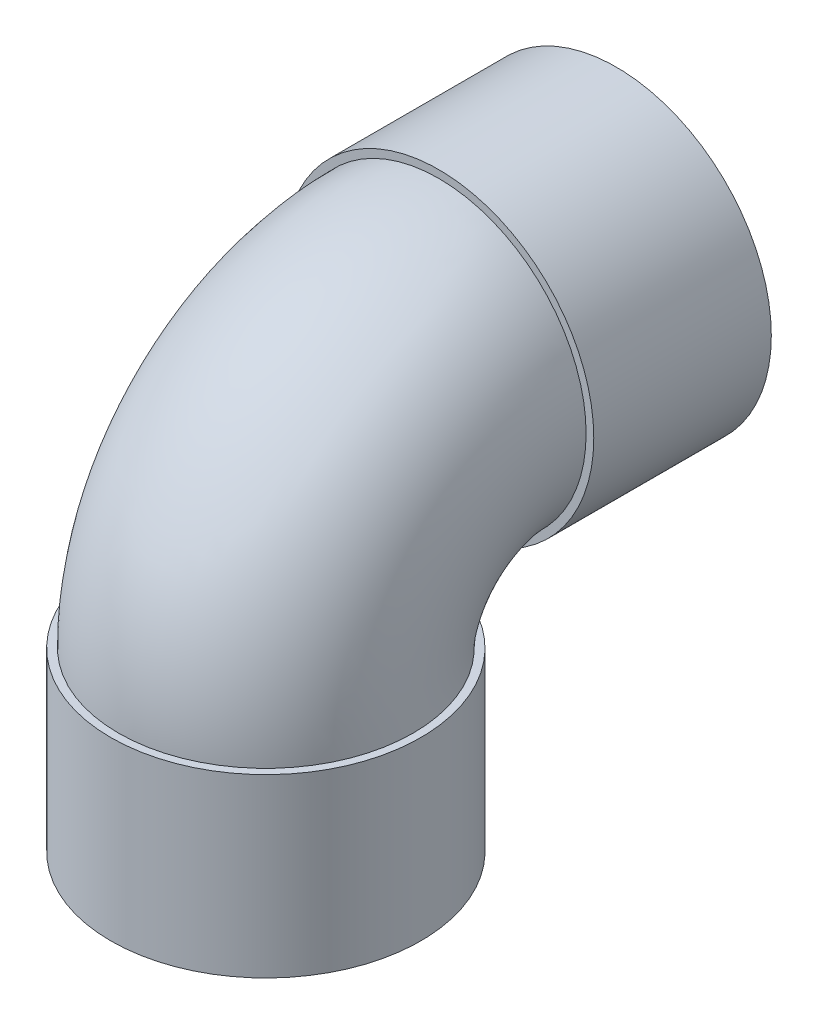
ISO-10303-21;
HEADER;
FILE_DESCRIPTION(('STEP AP214'),'2;1');
FILE_NAME('part.step','',(''),(''),'','','');
FILE_SCHEMA(('AUTOMOTIVE_DESIGN { 1 0 10303 214 1 1 1 1 }'));
ENDSEC;
DATA;
#1=APPLICATION_CONTEXT('core data for automotive mechanical design processes');
#2=APPLICATION_PROTOCOL_DEFINITION('international standard','automotive_design',2000,#1);
#3=PRODUCT_CONTEXT('',#1,'mechanical');
#4=PRODUCT('Part','Part','',(#3));
#5=PRODUCT_RELATED_PRODUCT_CATEGORY('part','',(#4));
#6=PRODUCT_DEFINITION_FORMATION('','',#4);
#7=PRODUCT_DEFINITION_CONTEXT('part definition',#1,'design');
#8=PRODUCT_DEFINITION('design','',#6,#7);
#9=PRODUCT_DEFINITION_SHAPE('','',#8);
#10=(LENGTH_UNIT() NAMED_UNIT(*) SI_UNIT(.MILLI.,.METRE.));
#11=(NAMED_UNIT(*) PLANE_ANGLE_UNIT() SI_UNIT($,.RADIAN.));
#12=(NAMED_UNIT(*) SI_UNIT($,.STERADIAN.) SOLID_ANGLE_UNIT());
#13=UNCERTAINTY_MEASURE_WITH_UNIT(LENGTH_MEASURE(1.E-05),#10,'distance_accuracy_value','');
#14=(GEOMETRIC_REPRESENTATION_CONTEXT(3) GLOBAL_UNCERTAINTY_ASSIGNED_CONTEXT((#13)) GLOBAL_UNIT_ASSIGNED_CONTEXT((#10,
#11,#12)) REPRESENTATION_CONTEXT('',''));
#15=CARTESIAN_POINT('',(0.,0.,0.));
#16=DIRECTION('',(0.,0.,1.));
#17=DIRECTION('',(1.,0.,0.));
#18=AXIS2_PLACEMENT_3D('',#15,#16,#17);
#19=CARTESIAN_POINT('',(0.,-30.6831415420024,30.6831415420023));
#20=DIRECTION('',(0.,-1.,0.));
#21=DIRECTION('',(1.,0.,0.));
#22=AXIS2_PLACEMENT_3D('',#19,#20,#21);
#23=PLANE('',#22);
#24=CARTESIAN_POINT('',(0.,-30.6831415420024,30.6831415420023));
#25=DIRECTION('',(0.,-1.,0.));
#26=DIRECTION('',(1.,0.,0.));
#27=AXIS2_PLACEMENT_3D('',#24,#25,#26);
#28=CIRCLE('',#27,22.14);
#29=CARTESIAN_POINT('',(0.,-30.6831415420025,52.8231415420023));
#30=VERTEX_POINT('',#29);
#31=EDGE_CURVE('E62',#30,#30,#28,.T.);
#32=ORIENTED_EDGE('',*,*,#31,.F.);
#33=EDGE_LOOP('',(#32));
#34=FACE_BOUND('',#33,.T.);
#35=CARTESIAN_POINT('',(0.,-30.6831415420024,30.6831415420023));
#36=DIRECTION('',(0.,-1.,0.));
#37=DIRECTION('',(0.,0.,-1.));
#38=AXIS2_PLACEMENT_3D('',#35,#36,#37);
#39=CIRCLE('',#38,25.25);
#40=CARTESIAN_POINT('',(0.,-30.6831415420023,5.43314154200231));
#41=VERTEX_POINT('',#40);
#42=EDGE_CURVE('E11',#41,#41,#39,.F.);
#43=ORIENTED_EDGE('',*,*,#42,.F.);
#44=EDGE_LOOP('',(#43));
#45=FACE_BOUND('',#44,.T.);
#46=ADVANCED_FACE('F49',(#34,#45),#23,.T.);
#47=CARTESIAN_POINT('',(0.,0.,0.));
#48=DIRECTION('',(0.,0.,1.));
#49=DIRECTION('',(1.,0.,0.));
#50=AXIS2_PLACEMENT_3D('',#47,#48,#49);
#51=PLANE('',#50);
#52=CARTESIAN_POINT('',(0.,0.,0.));
#53=DIRECTION('',(0.,0.,1.));
#54=DIRECTION('',(1.,0.,0.));
#55=AXIS2_PLACEMENT_3D('',#52,#53,#54);
#56=CIRCLE('',#55,22.14);
#57=CARTESIAN_POINT('',(0.,22.14,0.));
#58=VERTEX_POINT('',#57);
#59=EDGE_CURVE('E67',#58,#58,#56,.T.);
#60=ORIENTED_EDGE('',*,*,#59,.T.);
#61=EDGE_LOOP('',(#60));
#62=FACE_BOUND('',#61,.T.);
#63=CARTESIAN_POINT('',(0.,0.,0.));
#64=DIRECTION('',(0.,0.,-1.));
#65=DIRECTION('',(-1.,0.,0.));
#66=AXIS2_PLACEMENT_3D('',#63,#64,#65);
#67=CIRCLE('',#66,25.25);
#68=CARTESIAN_POINT('',(-25.25,0.,0.));
#69=VERTEX_POINT('',#68);
#70=EDGE_CURVE('E86',#69,#69,#67,.T.);
#71=ORIENTED_EDGE('',*,*,#70,.T.);
#72=EDGE_LOOP('',(#71));
#73=FACE_BOUND('',#72,.T.);
#74=ADVANCED_FACE('F125',(#62,#73),#51,.F.);
#75=CARTESIAN_POINT('',(0.,-30.6831415420023,0.));
#76=DIRECTION('',(-1.,0.,0.));
#77=DIRECTION('',(0.,0.,1.));
#78=AXIS2_PLACEMENT_3D('',#75,#76,#77);
#79=TOROIDAL_SURFACE('',#78,30.6831415420023,26.14);
#80=CARTESIAN_POINT('',(0.,-30.6831415420024,30.6831415420023));
#81=DIRECTION('',(0.,-1.,0.));
#82=DIRECTION('',(1.,0.,0.));
#83=AXIS2_PLACEMENT_3D('',#80,#81,#82);
#84=CIRCLE('',#83,26.14);
#85=CARTESIAN_POINT('',(0.,-30.6831415420025,56.8231415420023));
#86=VERTEX_POINT('',#85);
#87=EDGE_CURVE('E57',#86,#86,#84,.T.);
#88=CARTESIAN_POINT('',(0.,0.,0.));
#89=DIRECTION('',(0.,0.,-1.));
#90=DIRECTION('',(-1.,0.,0.));
#91=AXIS2_PLACEMENT_3D('',#88,#89,#90);
#92=CIRCLE('',#91,26.14);
#93=CARTESIAN_POINT('',(0.,26.14,0.));
#94=VERTEX_POINT('',#93);
#95=EDGE_CURVE('E73',#94,#94,#92,.T.);
#96=CARTESIAN_POINT('',(0.,-30.6831415420023,0.));
#97=DIRECTION('',(-1.,0.,0.));
#98=DIRECTION('',(0.,0.,1.));
#99=AXIS2_PLACEMENT_3D('',#96,#97,#98);
#100=CIRCLE('',#99,56.8231415420023);
#101=EDGE_CURVE('',#86,#94,#100,.T.);
#102=ORIENTED_EDGE('',*,*,#87,.F.);
#103=ORIENTED_EDGE('',*,*,#95,.F.);
#104=ORIENTED_EDGE('',*,*,#101,.T.);
#105=ORIENTED_EDGE('',*,*,#101,.F.);
#106=EDGE_LOOP('',(#102,#104,#103,#105));
#107=FACE_BOUND('',#106,.T.);
#108=ADVANCED_FACE('F51',(#107),#79,.T.);
#109=CARTESIAN_POINT('',(0.,-30.6831415420023,0.));
#110=DIRECTION('',(-1.,0.,0.));
#111=DIRECTION('',(0.,0.,1.));
#112=AXIS2_PLACEMENT_3D('',#109,#110,#111);
#113=TOROIDAL_SURFACE('',#112,30.6831415420023,22.14);
#114=CARTESIAN_POINT('',(0.,-30.6831415420023,0.));
#115=DIRECTION('',(-1.,0.,0.));
#116=DIRECTION('',(0.,0.,1.));
#117=AXIS2_PLACEMENT_3D('',#114,#115,#116);
#118=CIRCLE('',#117,52.8231415420023);
#119=EDGE_CURVE('',#30,#58,#118,.T.);
#120=ORIENTED_EDGE('',*,*,#31,.T.);
#121=ORIENTED_EDGE('',*,*,#59,.F.);
#122=ORIENTED_EDGE('',*,*,#119,.T.);
#123=ORIENTED_EDGE('',*,*,#119,.F.);
#124=EDGE_LOOP('',(#120,#122,#121,#123));
#125=FACE_BOUND('',#124,.T.);
#126=ADVANCED_FACE('F135',(#125),#113,.F.);
#127=CARTESIAN_POINT('',(0.,0.,-31.5));
#128=DIRECTION('',(0.,0.,-1.));
#129=DIRECTION('',(-1.,0.,0.));
#130=AXIS2_PLACEMENT_3D('',#127,#128,#129);
#131=PLANE('',#130);
#132=CARTESIAN_POINT('',(0.,0.,-31.5));
#133=DIRECTION('',(0.,0.,-1.));
#134=DIRECTION('',(-1.,0.,0.));
#135=AXIS2_PLACEMENT_3D('',#132,#133,#134);
#136=CIRCLE('',#135,27.5);
#137=CARTESIAN_POINT('',(-27.5,0.,-31.5));
#138=VERTEX_POINT('',#137);
#139=EDGE_CURVE('E77',#138,#138,#136,.T.);
#140=ORIENTED_EDGE('',*,*,#139,.T.);
#141=EDGE_LOOP('',(#140));
#142=FACE_BOUND('',#141,.T.);
#143=CARTESIAN_POINT('',(0.,0.,-31.5));
#144=DIRECTION('',(0.,0.,-1.));
#145=DIRECTION('',(-1.,0.,0.));
#146=AXIS2_PLACEMENT_3D('',#143,#144,#145);
#147=CIRCLE('',#146,25.25);
#148=CARTESIAN_POINT('',(-25.25,0.,-31.5));
#149=VERTEX_POINT('',#148);
#150=EDGE_CURVE('E82',#149,#149,#147,.T.);
#151=ORIENTED_EDGE('',*,*,#150,.F.);
#152=EDGE_LOOP('',(#151));
#153=FACE_BOUND('',#152,.T.);
#154=ADVANCED_FACE('F138',(#142,#153),#131,.T.);
#155=CARTESIAN_POINT('',(0.,0.,0.));
#156=DIRECTION('',(0.,0.,-1.));
#157=DIRECTION('',(-1.,0.,0.));
#158=AXIS2_PLACEMENT_3D('',#155,#156,#157);
#159=PLANE('',#158);
#160=ORIENTED_EDGE('',*,*,#95,.T.);
#161=EDGE_LOOP('',(#160));
#162=FACE_BOUND('',#161,.T.);
#163=CARTESIAN_POINT('',(0.,0.,0.));
#164=DIRECTION('',(0.,0.,-1.));
#165=DIRECTION('',(-1.,0.,0.));
#166=AXIS2_PLACEMENT_3D('',#163,#164,#165);
#167=CIRCLE('',#166,27.5);
#168=CARTESIAN_POINT('',(-27.5,0.,0.));
#169=VERTEX_POINT('',#168);
#170=EDGE_CURVE('E78',#169,#169,#167,.T.);
#171=ORIENTED_EDGE('',*,*,#170,.F.);
#172=EDGE_LOOP('',(#171));
#173=FACE_BOUND('',#172,.T.);
#174=ADVANCED_FACE('F142',(#162,#173),#159,.F.);
#175=CARTESIAN_POINT('',(0.,0.,-31.5));
#176=DIRECTION('',(0.,0.,1.));
#177=DIRECTION('',(1.,0.,0.));
#178=AXIS2_PLACEMENT_3D('',#175,#176,#177);
#179=CYLINDRICAL_SURFACE('',#178,27.5);
#180=ORIENTED_EDGE('',*,*,#139,.F.);
#181=EDGE_LOOP('',(#180));
#182=FACE_BOUND('',#181,.T.);
#183=ORIENTED_EDGE('',*,*,#170,.T.);
#184=EDGE_LOOP('',(#183));
#185=FACE_BOUND('',#184,.T.);
#186=ADVANCED_FACE('F120',(#182,#185),#179,.T.);
#187=CARTESIAN_POINT('',(0.,0.,-31.5));
#188=DIRECTION('',(0.,0.,1.));
#189=DIRECTION('',(1.,0.,0.));
#190=AXIS2_PLACEMENT_3D('',#187,#188,#189);
#191=CYLINDRICAL_SURFACE('',#190,25.25);
#192=ORIENTED_EDGE('',*,*,#150,.T.);
#193=EDGE_LOOP('',(#192));
#194=FACE_BOUND('',#193,.T.);
#195=ORIENTED_EDGE('',*,*,#70,.F.);
#196=EDGE_LOOP('',(#195));
#197=FACE_BOUND('',#196,.T.);
#198=ADVANCED_FACE('F111',(#194,#197),#191,.F.);
#199=CARTESIAN_POINT('',(0.,-61.9331415420024,30.6831415420022));
#200=DIRECTION('',(0.,-1.,0.));
#201=DIRECTION('',(0.,0.,-1.));
#202=AXIS2_PLACEMENT_3D('',#199,#200,#201);
#203=PLANE('',#202);
#204=CARTESIAN_POINT('',(0.,-61.9331415420024,30.6831415420022));
#205=DIRECTION('',(0.,-1.,0.));
#206=DIRECTION('',(0.,0.,-1.));
#207=AXIS2_PLACEMENT_3D('',#204,#205,#206);
#208=CIRCLE('',#207,27.5);
#209=CARTESIAN_POINT('',(0.,-61.9331415420023,3.18314154200221));
#210=VERTEX_POINT('',#209);
#211=EDGE_CURVE('E90',#210,#210,#208,.T.);
#212=ORIENTED_EDGE('',*,*,#211,.T.);
#213=EDGE_LOOP('',(#212));
#214=FACE_BOUND('',#213,.T.);
#215=CARTESIAN_POINT('',(0.,-61.9331415420024,30.6831415420022));
#216=DIRECTION('',(0.,-1.,0.));
#217=DIRECTION('',(1.,0.,0.));
#218=AXIS2_PLACEMENT_3D('',#215,#216,#217);
#219=CIRCLE('',#218,25.25);
#220=CARTESIAN_POINT('',(25.25,-61.9331415420024,30.6831415420022));
#221=VERTEX_POINT('',#220);
#222=EDGE_CURVE('E98',#221,#221,#219,.T.);
#223=ORIENTED_EDGE('',*,*,#222,.F.);
#224=EDGE_LOOP('',(#223));
#225=FACE_BOUND('',#224,.T.);
#226=ADVANCED_FACE('F108',(#214,#225),#203,.T.);
#227=CARTESIAN_POINT('',(0.,-30.6831415420024,30.6831415420023));
#228=DIRECTION('',(0.,-1.,0.));
#229=DIRECTION('',(0.,0.,-1.));
#230=AXIS2_PLACEMENT_3D('',#227,#228,#229);
#231=PLANE('',#230);
#232=ORIENTED_EDGE('',*,*,#87,.T.);
#233=EDGE_LOOP('',(#232));
#234=FACE_BOUND('',#233,.T.);
#235=CARTESIAN_POINT('',(0.,-30.6831415420024,30.6831415420023));
#236=DIRECTION('',(0.,-1.,0.));
#237=DIRECTION('',(0.,0.,-1.));
#238=AXIS2_PLACEMENT_3D('',#235,#236,#237);
#239=CIRCLE('',#238,27.5);
#240=CARTESIAN_POINT('',(0.,-30.6831415420023,3.18314154200232));
#241=VERTEX_POINT('',#240);
#242=EDGE_CURVE('E94',#241,#241,#239,.T.);
#243=ORIENTED_EDGE('',*,*,#242,.F.);
#244=EDGE_LOOP('',(#243));
#245=FACE_BOUND('',#244,.T.);
#246=ADVANCED_FACE('F110',(#234,#245),#231,.F.);
#247=CARTESIAN_POINT('',(0.,-61.9331415420024,30.6831415420022));
#248=DIRECTION('',(0.,1.,0.));
#249=DIRECTION('',(0.,0.,1.));
#250=AXIS2_PLACEMENT_3D('',#247,#248,#249);
#251=CYLINDRICAL_SURFACE('',#250,27.5);
#252=ORIENTED_EDGE('',*,*,#211,.F.);
#253=EDGE_LOOP('',(#252));
#254=FACE_BOUND('',#253,.T.);
#255=ORIENTED_EDGE('',*,*,#242,.T.);
#256=EDGE_LOOP('',(#255));
#257=FACE_BOUND('',#256,.T.);
#258=ADVANCED_FACE('F118',(#254,#257),#251,.T.);
#259=CARTESIAN_POINT('',(0.,-61.9331415420024,30.6831415420022));
#260=DIRECTION('',(0.,1.,0.));
#261=DIRECTION('',(0.,0.,1.));
#262=AXIS2_PLACEMENT_3D('',#259,#260,#261);
#263=CYLINDRICAL_SURFACE('',#262,25.25);
#264=ORIENTED_EDGE('',*,*,#222,.T.);
#265=EDGE_LOOP('',(#264));
#266=FACE_BOUND('',#265,.T.);
#267=ORIENTED_EDGE('',*,*,#42,.T.);
#268=EDGE_LOOP('',(#267));
#269=FACE_BOUND('',#268,.T.);
#270=ADVANCED_FACE('F106',(#266,#269),#263,.F.);
#271=CLOSED_SHELL('',(#46,#74,#108,#126,#154,#174,#186,#198,#226,#246,#258,#270));
#272=MANIFOLD_SOLID_BREP('B2',#271);
#273=ADVANCED_BREP_SHAPE_REPRESENTATION('',(#18,#272),#14);
#274=SHAPE_DEFINITION_REPRESENTATION(#9,#273);
ENDSEC;
END-ISO-10303-21;
